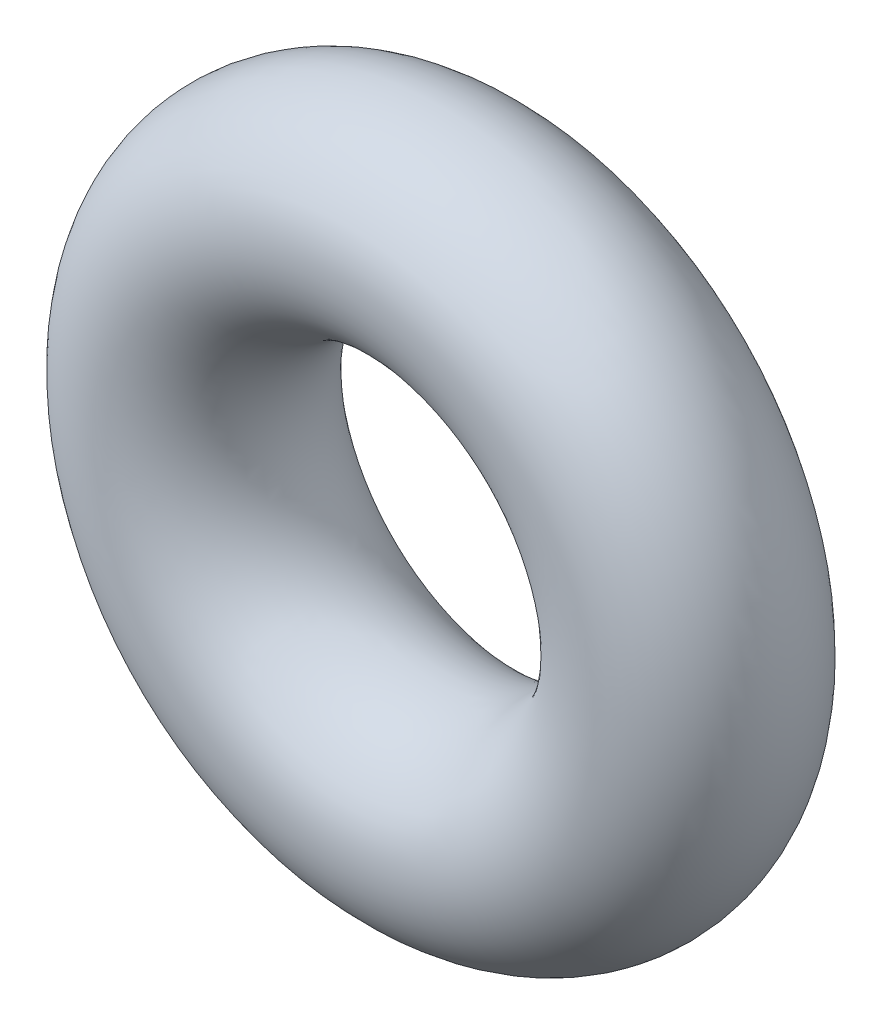
ISO-10303-21;
HEADER;
FILE_DESCRIPTION(('STEP AP214'),'2;1');
FILE_NAME('part.step','',(''),(''),'','','');
FILE_SCHEMA(('AUTOMOTIVE_DESIGN { 1 0 10303 214 1 1 1 1 }'));
ENDSEC;
DATA;
#1=APPLICATION_CONTEXT('core data for automotive mechanical design processes');
#2=APPLICATION_PROTOCOL_DEFINITION('international standard','automotive_design',2000,#1);
#3=PRODUCT_CONTEXT('',#1,'mechanical');
#4=PRODUCT('Part','Part','',(#3));
#5=PRODUCT_RELATED_PRODUCT_CATEGORY('part','',(#4));
#6=PRODUCT_DEFINITION_FORMATION('','',#4);
#7=PRODUCT_DEFINITION_CONTEXT('part definition',#1,'design');
#8=PRODUCT_DEFINITION('design','',#6,#7);
#9=PRODUCT_DEFINITION_SHAPE('','',#8);
#10=(LENGTH_UNIT() NAMED_UNIT(*) SI_UNIT(.MILLI.,.METRE.));
#11=(NAMED_UNIT(*) PLANE_ANGLE_UNIT() SI_UNIT($,.RADIAN.));
#12=(NAMED_UNIT(*) SI_UNIT($,.STERADIAN.) SOLID_ANGLE_UNIT());
#13=UNCERTAINTY_MEASURE_WITH_UNIT(LENGTH_MEASURE(1.E-05),#10,'distance_accuracy_value','');
#14=(GEOMETRIC_REPRESENTATION_CONTEXT(3) GLOBAL_UNCERTAINTY_ASSIGNED_CONTEXT((#13)) GLOBAL_UNIT_ASSIGNED_CONTEXT((#10,
#11,#12)) REPRESENTATION_CONTEXT('',''));
#15=CARTESIAN_POINT('',(0.,0.,0.));
#16=DIRECTION('',(0.,0.,1.));
#17=DIRECTION('',(1.,0.,0.));
#18=AXIS2_PLACEMENT_3D('',#15,#16,#17);
#19=CARTESIAN_POINT('',(0.,0.,0.));
#20=DIRECTION('',(0.,0.,1.));
#21=DIRECTION('',(1.,0.,0.));
#22=AXIS2_PLACEMENT_3D('',#19,#20,#21);
#23=TOROIDAL_SURFACE('',#22,1.9,0.8);
#24=CARTESIAN_POINT('',(2.7,0.,0.));
#25=VERTEX_POINT('',#24);
#26=VERTEX_LOOP('',#25);
#27=FACE_BOUND('',#26,.T.);
#28=ADVANCED_FACE('F26',(#27),#23,.T.);
#29=CLOSED_SHELL('',(#28));
#30=MANIFOLD_SOLID_BREP('B2',#29);
#31=ADVANCED_BREP_SHAPE_REPRESENTATION('',(#18,#30),#14);
#32=SHAPE_DEFINITION_REPRESENTATION(#9,#31);
ENDSEC;
END-ISO-10303-21;
